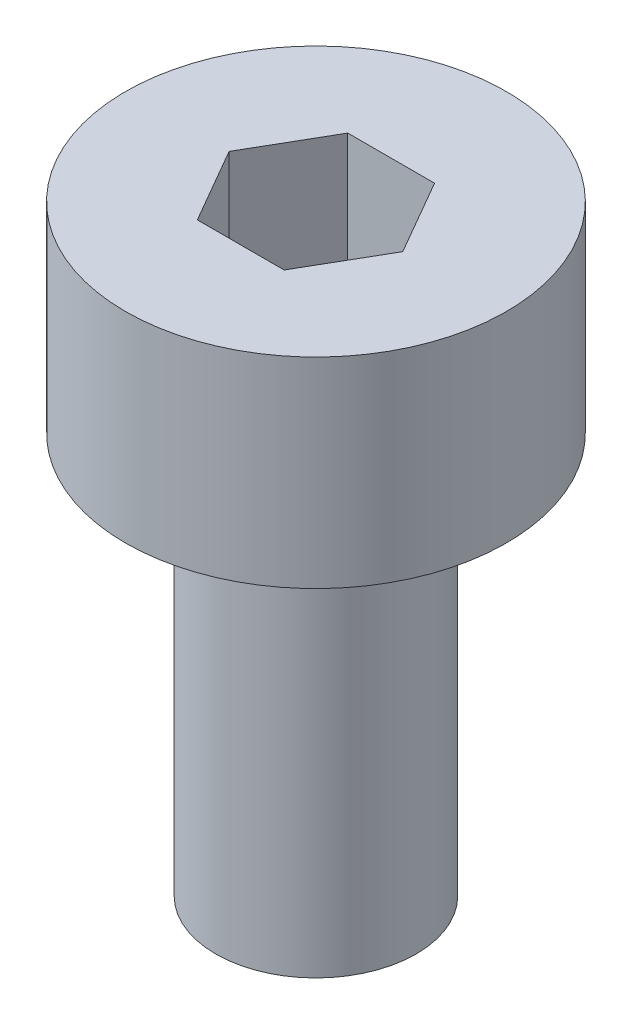
ISO-10303-21;
HEADER;
FILE_DESCRIPTION(('STEP AP214'),'2;1');
FILE_NAME('part.step','',(''),(''),'','','');
FILE_SCHEMA(('AUTOMOTIVE_DESIGN { 1 0 10303 214 1 1 1 1 }'));
ENDSEC;
DATA;
#1=APPLICATION_CONTEXT('core data for automotive mechanical design processes');
#2=APPLICATION_PROTOCOL_DEFINITION('international standard','automotive_design',2000,#1);
#3=PRODUCT_CONTEXT('',#1,'mechanical');
#4=PRODUCT('Part','Part','',(#3));
#5=PRODUCT_RELATED_PRODUCT_CATEGORY('part','',(#4));
#6=PRODUCT_DEFINITION_FORMATION('','',#4);
#7=PRODUCT_DEFINITION_CONTEXT('part definition',#1,'design');
#8=PRODUCT_DEFINITION('design','',#6,#7);
#9=PRODUCT_DEFINITION_SHAPE('','',#8);
#10=(LENGTH_UNIT() NAMED_UNIT(*) SI_UNIT(.MILLI.,.METRE.));
#11=(NAMED_UNIT(*) PLANE_ANGLE_UNIT() SI_UNIT($,.RADIAN.));
#12=(NAMED_UNIT(*) SI_UNIT($,.STERADIAN.) SOLID_ANGLE_UNIT());
#13=UNCERTAINTY_MEASURE_WITH_UNIT(LENGTH_MEASURE(1.E-05),#10,'distance_accuracy_value','');
#14=(GEOMETRIC_REPRESENTATION_CONTEXT(3) GLOBAL_UNCERTAINTY_ASSIGNED_CONTEXT((#13)) GLOBAL_UNIT_ASSIGNED_CONTEXT((#10,
#11,#12)) REPRESENTATION_CONTEXT('',''));
#15=CARTESIAN_POINT('',(0.,0.,0.));
#16=DIRECTION('',(0.,0.,1.));
#17=DIRECTION('',(1.,0.,0.));
#18=AXIS2_PLACEMENT_3D('',#15,#16,#17);
#19=CARTESIAN_POINT('',(0.,-4.,0.));
#20=DIRECTION('',(0.,1.,0.));
#21=DIRECTION('',(0.,0.,1.));
#22=AXIS2_PLACEMENT_3D('',#19,#20,#21);
#23=PLANE('',#22);
#24=CARTESIAN_POINT('',(0.,-4.,0.));
#25=DIRECTION('',(0.,1.,0.));
#26=DIRECTION('',(0.,0.,1.));
#27=AXIS2_PLACEMENT_3D('',#24,#25,#26);
#28=CIRCLE('',#27,1.00000000000001);
#29=CARTESIAN_POINT('',(0.,-4.,1.00000000000001));
#30=VERTEX_POINT('',#29);
#31=EDGE_CURVE('E11',#30,#30,#28,.T.);
#32=ORIENTED_EDGE('',*,*,#31,.F.);
#33=EDGE_LOOP('',(#32));
#34=FACE_BOUND('',#33,.T.);
#35=ADVANCED_FACE('F34',(#34),#23,.F.);
#36=CARTESIAN_POINT('',(0.,61.6916426261037,0.));
#37=DIRECTION('',(0.,1.,0.));
#38=DIRECTION('',(0.,0.,1.));
#39=AXIS2_PLACEMENT_3D('',#36,#37,#38);
#40=CYLINDRICAL_SURFACE('',#39,1.00000000000001);
#41=CARTESIAN_POINT('',(0.,0.,0.));
#42=DIRECTION('',(0.,1.,0.));
#43=DIRECTION('',(0.,0.,1.));
#44=AXIS2_PLACEMENT_3D('',#41,#42,#43);
#45=CIRCLE('',#44,1.00000000000001);
#46=CARTESIAN_POINT('',(0.,0.,1.00000000000001));
#47=VERTEX_POINT('',#46);
#48=EDGE_CURVE('E41',#47,#47,#45,.T.);
#49=ORIENTED_EDGE('',*,*,#48,.F.);
#50=EDGE_LOOP('',(#49));
#51=FACE_BOUND('',#50,.T.);
#52=ORIENTED_EDGE('',*,*,#31,.T.);
#53=EDGE_LOOP('',(#52));
#54=FACE_BOUND('',#53,.T.);
#55=ADVANCED_FACE('F150',(#51,#54),#40,.T.);
#56=CARTESIAN_POINT('',(1.00000000000001,0.,0.));
#57=DIRECTION('',(0.,1.,0.));
#58=DIRECTION('',(0.,0.,1.));
#59=AXIS2_PLACEMENT_3D('',#56,#57,#58);
#60=PLANE('',#59);
#61=CARTESIAN_POINT('',(0.,0.,0.));
#62=DIRECTION('',(0.,1.,0.));
#63=DIRECTION('',(0.,0.,1.));
#64=AXIS2_PLACEMENT_3D('',#61,#62,#63);
#65=CIRCLE('',#64,1.90000000000001);
#66=CARTESIAN_POINT('',(0.,0.,1.90000000000001));
#67=VERTEX_POINT('',#66);
#68=EDGE_CURVE('E143',#67,#67,#65,.T.);
#69=ORIENTED_EDGE('',*,*,#68,.F.);
#70=EDGE_LOOP('',(#69));
#71=FACE_BOUND('',#70,.T.);
#72=ORIENTED_EDGE('',*,*,#48,.T.);
#73=EDGE_LOOP('',(#72));
#74=FACE_BOUND('',#73,.T.);
#75=ADVANCED_FACE('F148',(#71,#74),#60,.F.);
#76=CARTESIAN_POINT('',(0.,61.6916426261037,0.));
#77=DIRECTION('',(0.,1.,0.));
#78=DIRECTION('',(0.,0.,1.));
#79=AXIS2_PLACEMENT_3D('',#76,#77,#78);
#80=CYLINDRICAL_SURFACE('',#79,1.90000000000001);
#81=CARTESIAN_POINT('',(0.,2.,0.));
#82=DIRECTION('',(0.,1.,0.));
#83=DIRECTION('',(0.,0.,1.));
#84=AXIS2_PLACEMENT_3D('',#81,#82,#83);
#85=CIRCLE('',#84,1.90000000000001);
#86=CARTESIAN_POINT('',(0.,2.,1.90000000000001));
#87=VERTEX_POINT('',#86);
#88=EDGE_CURVE('E135',#87,#87,#85,.T.);
#89=ORIENTED_EDGE('',*,*,#88,.F.);
#90=EDGE_LOOP('',(#89));
#91=FACE_BOUND('',#90,.T.);
#92=ORIENTED_EDGE('',*,*,#68,.T.);
#93=EDGE_LOOP('',(#92));
#94=FACE_BOUND('',#93,.T.);
#95=ADVANCED_FACE('F168',(#91,#94),#80,.T.);
#96=CARTESIAN_POINT('',(1.90000000000001,2.,0.));
#97=DIRECTION('',(0.,-1.,0.));
#98=DIRECTION('',(0.,0.,-1.));
#99=AXIS2_PLACEMENT_3D('',#96,#97,#98);
#100=PLANE('',#99);
#101=DIRECTION('',(-1.,0.,0.));
#102=VECTOR('',#101,1.);
#103=CARTESIAN_POINT('',(0.43301270189222,2.,-0.75));
#104=LINE('',#103,#102);
#105=CARTESIAN_POINT('',(0.43301270189222,2.,-0.75));
#106=VERTEX_POINT('',#105);
#107=CARTESIAN_POINT('',(-0.433012701892219,2.,-0.75));
#108=VERTEX_POINT('',#107);
#109=EDGE_CURVE('E122',#106,#108,#104,.T.);
#110=ORIENTED_EDGE('',*,*,#109,.F.);
#111=DIRECTION('',(-0.5,0.,-0.866025403784439));
#112=VECTOR('',#111,1.);
#113=CARTESIAN_POINT('',(0.86602540378444,2.,0.));
#114=LINE('',#113,#112);
#115=CARTESIAN_POINT('',(0.86602540378444,2.,0.));
#116=VERTEX_POINT('',#115);
#117=EDGE_CURVE('E48',#116,#106,#114,.T.);
#118=ORIENTED_EDGE('',*,*,#117,.F.);
#119=DIRECTION('',(0.5,0.,-0.866025403784439));
#120=VECTOR('',#119,1.);
#121=CARTESIAN_POINT('',(0.433012701892221,2.,0.75));
#122=LINE('',#121,#120);
#123=CARTESIAN_POINT('',(0.433012701892221,2.,0.75));
#124=VERTEX_POINT('',#123);
#125=EDGE_CURVE('E131',#124,#116,#122,.T.);
#126=ORIENTED_EDGE('',*,*,#125,.F.);
#127=DIRECTION('',(1.,0.,0.));
#128=VECTOR('',#127,1.);
#129=CARTESIAN_POINT('',(-0.433012701892218,2.,0.749999999999999));
#130=LINE('',#129,#128);
#131=CARTESIAN_POINT('',(-0.433012701892218,2.,0.749999999999999));
#132=VERTEX_POINT('',#131);
#133=EDGE_CURVE('E129',#132,#124,#130,.T.);
#134=ORIENTED_EDGE('',*,*,#133,.F.);
#135=DIRECTION('',(0.5,0.,0.866025403784439));
#136=VECTOR('',#135,1.);
#137=CARTESIAN_POINT('',(-0.866025403784438,2.,0.));
#138=LINE('',#137,#136);
#139=CARTESIAN_POINT('',(-0.866025403784438,2.,0.));
#140=VERTEX_POINT('',#139);
#141=EDGE_CURVE('E96',#140,#132,#138,.T.);
#142=ORIENTED_EDGE('',*,*,#141,.F.);
#143=DIRECTION('',(-0.5,0.,0.866025403784439));
#144=VECTOR('',#143,1.);
#145=CARTESIAN_POINT('',(-0.433012701892219,2.,-0.75));
#146=LINE('',#145,#144);
#147=EDGE_CURVE('E125',#108,#140,#146,.T.);
#148=ORIENTED_EDGE('',*,*,#147,.F.);
#149=EDGE_LOOP('',(#110,#118,#126,#134,#142,#148));
#150=FACE_BOUND('',#149,.T.);
#151=ORIENTED_EDGE('',*,*,#88,.T.);
#152=EDGE_LOOP('',(#151));
#153=FACE_BOUND('',#152,.T.);
#154=ADVANCED_FACE('F176',(#150,#153),#100,.F.);
#155=CARTESIAN_POINT('',(0.86602540378444,0.5,0.));
#156=DIRECTION('',(0.866025403784438,0.,-0.5));
#157=DIRECTION('',(-0.5,0.,-0.866025403784439));
#158=AXIS2_PLACEMENT_3D('',#155,#156,#157);
#159=PLANE('',#158);
#160=ORIENTED_EDGE('',*,*,#117,.T.);
#161=DIRECTION('',(0.,1.,0.));
#162=VECTOR('',#161,1.);
#163=CARTESIAN_POINT('',(0.43301270189222,0.5,-0.75));
#164=LINE('',#163,#162);
#165=CARTESIAN_POINT('',(0.43301270189222,0.5,-0.75));
#166=VERTEX_POINT('',#165);
#167=EDGE_CURVE('E78',#166,#106,#164,.T.);
#168=ORIENTED_EDGE('',*,*,#167,.F.);
#169=DIRECTION('',(-0.5,0.,-0.866025403784439));
#170=VECTOR('',#169,1.);
#171=CARTESIAN_POINT('',(0.86602540378444,0.5,0.));
#172=LINE('',#171,#170);
#173=CARTESIAN_POINT('',(0.86602540378444,0.5,0.));
#174=VERTEX_POINT('',#173);
#175=EDGE_CURVE('E133',#174,#166,#172,.T.);
#176=ORIENTED_EDGE('',*,*,#175,.F.);
#177=DIRECTION('',(0.,1.,0.));
#178=VECTOR('',#177,1.);
#179=CARTESIAN_POINT('',(0.86602540378444,0.5,0.));
#180=LINE('',#179,#178);
#181=EDGE_CURVE('E56',#174,#116,#180,.T.);
#182=ORIENTED_EDGE('',*,*,#181,.T.);
#183=EDGE_LOOP('',(#160,#168,#176,#182));
#184=FACE_BOUND('',#183,.T.);
#185=ADVANCED_FACE('F184',(#184),#159,.F.);
#186=CARTESIAN_POINT('',(0.433012701892221,0.5,0.75));
#187=DIRECTION('',(0.866025403784439,0.,0.5));
#188=DIRECTION('',(0.5,0.,-0.866025403784439));
#189=AXIS2_PLACEMENT_3D('',#186,#187,#188);
#190=PLANE('',#189);
#191=ORIENTED_EDGE('',*,*,#125,.T.);
#192=ORIENTED_EDGE('',*,*,#181,.F.);
#193=DIRECTION('',(0.5,0.,-0.866025403784439));
#194=VECTOR('',#193,1.);
#195=CARTESIAN_POINT('',(0.433012701892221,0.5,0.75));
#196=LINE('',#195,#194);
#197=CARTESIAN_POINT('',(0.433012701892221,0.5,0.75));
#198=VERTEX_POINT('',#197);
#199=EDGE_CURVE('E108',#198,#174,#196,.T.);
#200=ORIENTED_EDGE('',*,*,#199,.F.);
#201=DIRECTION('',(0.,1.,0.));
#202=VECTOR('',#201,1.);
#203=CARTESIAN_POINT('',(0.433012701892221,0.5,0.75));
#204=LINE('',#203,#202);
#205=EDGE_CURVE('E100',#198,#124,#204,.T.);
#206=ORIENTED_EDGE('',*,*,#205,.T.);
#207=EDGE_LOOP('',(#191,#192,#200,#206));
#208=FACE_BOUND('',#207,.T.);
#209=ADVANCED_FACE('F192',(#208),#190,.F.);
#210=CARTESIAN_POINT('',(-0.433012701892218,0.5,0.749999999999999));
#211=DIRECTION('',(0.,0.,1.));
#212=DIRECTION('',(1.,0.,0.));
#213=AXIS2_PLACEMENT_3D('',#210,#211,#212);
#214=PLANE('',#213);
#215=ORIENTED_EDGE('',*,*,#133,.T.);
#216=ORIENTED_EDGE('',*,*,#205,.F.);
#217=DIRECTION('',(1.,0.,0.));
#218=VECTOR('',#217,1.);
#219=CARTESIAN_POINT('',(-0.433012701892218,0.5,0.749999999999999));
#220=LINE('',#219,#218);
#221=CARTESIAN_POINT('',(-0.433012701892218,0.5,0.749999999999999));
#222=VERTEX_POINT('',#221);
#223=EDGE_CURVE('E104',#222,#198,#220,.T.);
#224=ORIENTED_EDGE('',*,*,#223,.F.);
#225=DIRECTION('',(0.,1.,0.));
#226=VECTOR('',#225,1.);
#227=CARTESIAN_POINT('',(-0.433012701892218,0.5,0.749999999999999));
#228=LINE('',#227,#226);
#229=EDGE_CURVE('E89',#222,#132,#228,.T.);
#230=ORIENTED_EDGE('',*,*,#229,.T.);
#231=EDGE_LOOP('',(#215,#216,#224,#230));
#232=FACE_BOUND('',#231,.T.);
#233=ADVANCED_FACE('F105',(#232),#214,.F.);
#234=CARTESIAN_POINT('',(-0.866025403784438,0.5,0.));
#235=DIRECTION('',(-0.866025403784438,0.,0.5));
#236=DIRECTION('',(0.5,0.,0.866025403784439));
#237=AXIS2_PLACEMENT_3D('',#234,#235,#236);
#238=PLANE('',#237);
#239=ORIENTED_EDGE('',*,*,#141,.T.);
#240=ORIENTED_EDGE('',*,*,#229,.F.);
#241=DIRECTION('',(0.5,0.,0.866025403784439));
#242=VECTOR('',#241,1.);
#243=CARTESIAN_POINT('',(-0.866025403784438,0.5,0.));
#244=LINE('',#243,#242);
#245=CARTESIAN_POINT('',(-0.866025403784438,0.5,0.));
#246=VERTEX_POINT('',#245);
#247=EDGE_CURVE('E93',#246,#222,#244,.T.);
#248=ORIENTED_EDGE('',*,*,#247,.F.);
#249=DIRECTION('',(0.,1.,0.));
#250=VECTOR('',#249,1.);
#251=CARTESIAN_POINT('',(-0.866025403784438,0.5,0.));
#252=LINE('',#251,#250);
#253=EDGE_CURVE('E101',#246,#140,#252,.T.);
#254=ORIENTED_EDGE('',*,*,#253,.T.);
#255=EDGE_LOOP('',(#239,#240,#248,#254));
#256=FACE_BOUND('',#255,.T.);
#257=ADVANCED_FACE('F91',(#256),#238,.F.);
#258=CARTESIAN_POINT('',(-0.433012701892219,0.5,-0.75));
#259=DIRECTION('',(-0.866025403784439,0.,-0.5));
#260=DIRECTION('',(-0.5,0.,0.866025403784439));
#261=AXIS2_PLACEMENT_3D('',#258,#259,#260);
#262=PLANE('',#261);
#263=ORIENTED_EDGE('',*,*,#147,.T.);
#264=ORIENTED_EDGE('',*,*,#253,.F.);
#265=DIRECTION('',(-0.5,0.,0.866025403784439));
#266=VECTOR('',#265,1.);
#267=CARTESIAN_POINT('',(-0.433012701892219,0.5,-0.75));
#268=LINE('',#267,#266);
#269=CARTESIAN_POINT('',(-0.433012701892219,0.5,-0.75));
#270=VERTEX_POINT('',#269);
#271=EDGE_CURVE('E114',#270,#246,#268,.T.);
#272=ORIENTED_EDGE('',*,*,#271,.F.);
#273=DIRECTION('',(0.,1.,0.));
#274=VECTOR('',#273,1.);
#275=CARTESIAN_POINT('',(-0.433012701892219,0.5,-0.75));
#276=LINE('',#275,#274);
#277=EDGE_CURVE('E138',#270,#108,#276,.T.);
#278=ORIENTED_EDGE('',*,*,#277,.T.);
#279=EDGE_LOOP('',(#263,#264,#272,#278));
#280=FACE_BOUND('',#279,.T.);
#281=ADVANCED_FACE('F211',(#280),#262,.F.);
#282=CARTESIAN_POINT('',(0.43301270189222,0.5,-0.75));
#283=DIRECTION('',(0.,0.,-1.));
#284=DIRECTION('',(-1.,0.,0.));
#285=AXIS2_PLACEMENT_3D('',#282,#283,#284);
#286=PLANE('',#285);
#287=ORIENTED_EDGE('',*,*,#109,.T.);
#288=ORIENTED_EDGE('',*,*,#277,.F.);
#289=DIRECTION('',(-1.,0.,0.));
#290=VECTOR('',#289,1.);
#291=CARTESIAN_POINT('',(0.43301270189222,0.5,-0.75));
#292=LINE('',#291,#290);
#293=EDGE_CURVE('E116',#166,#270,#292,.T.);
#294=ORIENTED_EDGE('',*,*,#293,.F.);
#295=ORIENTED_EDGE('',*,*,#167,.T.);
#296=EDGE_LOOP('',(#287,#288,#294,#295));
#297=FACE_BOUND('',#296,.T.);
#298=ADVANCED_FACE('F218',(#297),#286,.F.);
#299=CARTESIAN_POINT('',(0.43301270189222,0.5,-0.75));
#300=DIRECTION('',(0.,1.,0.));
#301=DIRECTION('',(0.,0.,1.));
#302=AXIS2_PLACEMENT_3D('',#299,#300,#301);
#303=PLANE('',#302);
#304=ORIENTED_EDGE('',*,*,#175,.T.);
#305=ORIENTED_EDGE('',*,*,#293,.T.);
#306=ORIENTED_EDGE('',*,*,#271,.T.);
#307=ORIENTED_EDGE('',*,*,#247,.T.);
#308=ORIENTED_EDGE('',*,*,#223,.T.);
#309=ORIENTED_EDGE('',*,*,#199,.T.);
#310=EDGE_LOOP('',(#304,#305,#306,#307,#308,#309));
#311=FACE_BOUND('',#310,.T.);
#312=ADVANCED_FACE('F111',(#311),#303,.T.);
#313=CLOSED_SHELL('',(#35,#55,#75,#95,#154,#185,#209,#233,#257,#281,#298,#312));
#314=MANIFOLD_SOLID_BREP('B2',#313);
#315=ADVANCED_BREP_SHAPE_REPRESENTATION('',(#18,#314),#14);
#316=SHAPE_DEFINITION_REPRESENTATION(#9,#315);
ENDSEC;
END-ISO-10303-21;
